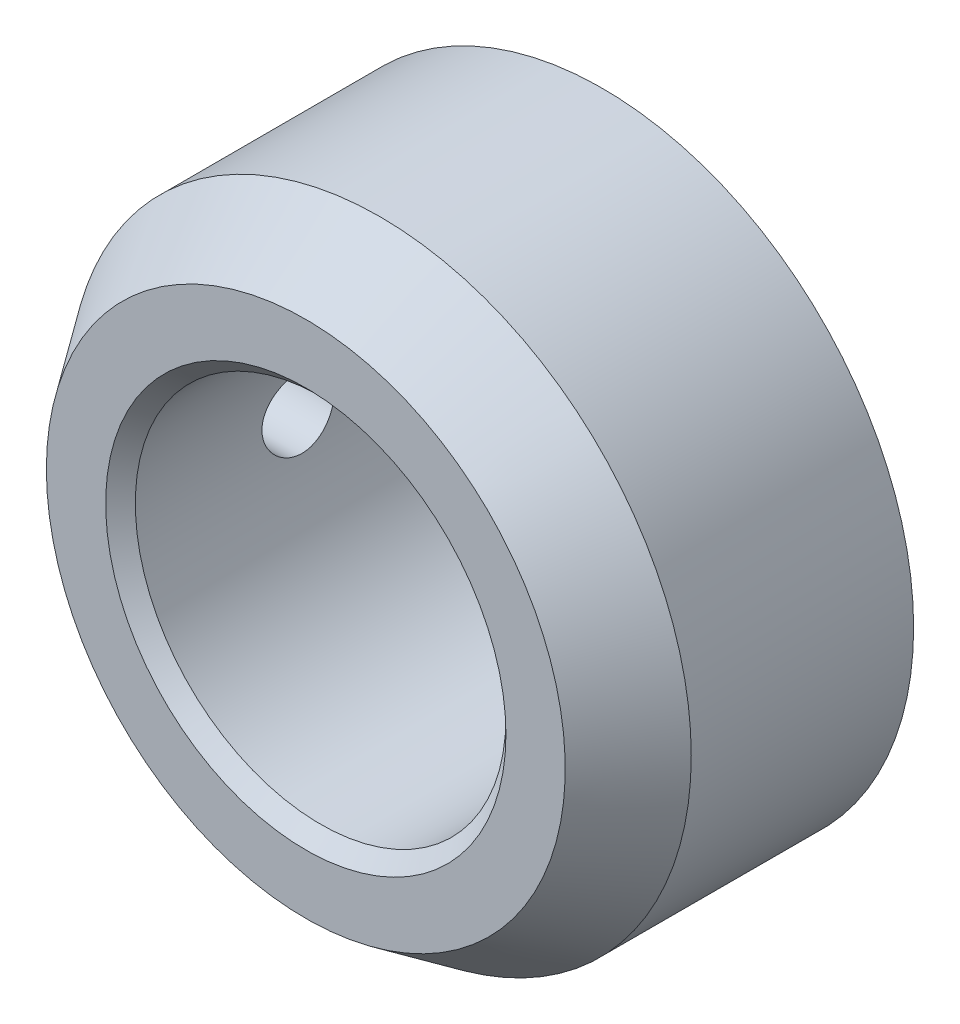
ISO-10303-21;
HEADER;
FILE_DESCRIPTION(('STEP AP214'),'2;1');
FILE_NAME('part.step','',(''),(''),'','','');
FILE_SCHEMA(('AUTOMOTIVE_DESIGN { 1 0 10303 214 1 1 1 1 }'));
ENDSEC;
DATA;
#1=APPLICATION_CONTEXT('core data for automotive mechanical design processes');
#2=APPLICATION_PROTOCOL_DEFINITION('international standard','automotive_design',2000,#1);
#3=PRODUCT_CONTEXT('',#1,'mechanical');
#4=PRODUCT('Part','Part','',(#3));
#5=PRODUCT_RELATED_PRODUCT_CATEGORY('part','',(#4));
#6=PRODUCT_DEFINITION_FORMATION('','',#4);
#7=PRODUCT_DEFINITION_CONTEXT('part definition',#1,'design');
#8=PRODUCT_DEFINITION('design','',#6,#7);
#9=PRODUCT_DEFINITION_SHAPE('','',#8);
#10=(LENGTH_UNIT() NAMED_UNIT(*) SI_UNIT(.MILLI.,.METRE.));
#11=(NAMED_UNIT(*) PLANE_ANGLE_UNIT() SI_UNIT($,.RADIAN.));
#12=(NAMED_UNIT(*) SI_UNIT($,.STERADIAN.) SOLID_ANGLE_UNIT());
#13=UNCERTAINTY_MEASURE_WITH_UNIT(LENGTH_MEASURE(1.E-05),#10,'distance_accuracy_value','');
#14=(GEOMETRIC_REPRESENTATION_CONTEXT(3) GLOBAL_UNCERTAINTY_ASSIGNED_CONTEXT((#13)) GLOBAL_UNIT_ASSIGNED_CONTEXT((#10,
#11,#12)) REPRESENTATION_CONTEXT('',''));
#15=CARTESIAN_POINT('',(0.,0.,0.));
#16=DIRECTION('',(0.,0.,1.));
#17=DIRECTION('',(1.,0.,0.));
#18=AXIS2_PLACEMENT_3D('',#15,#16,#17);
#19=CARTESIAN_POINT('',(0.,0.,9.99999999999872));
#20=DIRECTION('',(0.,0.,1.));
#21=DIRECTION('',(1.,0.,0.));
#22=AXIS2_PLACEMENT_3D('',#19,#20,#21);
#23=CONICAL_SURFACE('',#22,13.5000000000013,0.785398163400004);
#24=CARTESIAN_POINT('',(0.,0.,9.99999999999872));
#25=DIRECTION('',(0.,0.,1.));
#26=DIRECTION('',(1.,0.,0.));
#27=AXIS2_PLACEMENT_3D('',#24,#25,#26);
#28=CIRCLE('',#27,13.5000000000013);
#29=CARTESIAN_POINT('',(13.5000000000013,0.,9.99999999999872));
#30=VERTEX_POINT('',#29);
#31=EDGE_CURVE('E18',#30,#30,#28,.F.);
#32=ORIENTED_EDGE('',*,*,#31,.F.);
#33=EDGE_LOOP('',(#32));
#34=FACE_BOUND('',#33,.T.);
#35=CARTESIAN_POINT('',(0.,0.,9.));
#36=DIRECTION('',(0.,0.,1.));
#37=DIRECTION('',(1.,0.,0.));
#38=AXIS2_PLACEMENT_3D('',#35,#36,#37);
#39=CIRCLE('',#38,12.5);
#40=CARTESIAN_POINT('',(12.5,0.,9.));
#41=VERTEX_POINT('',#40);
#42=EDGE_CURVE('E32',#41,#41,#39,.F.);
#43=ORIENTED_EDGE('',*,*,#42,.T.);
#44=EDGE_LOOP('',(#43));
#45=FACE_BOUND('',#44,.T.);
#46=ADVANCED_FACE('F15',(#34,#45),#23,.F.);
#47=CARTESIAN_POINT('',(0.,0.,0.));
#48=DIRECTION('',(0.,0.,1.));
#49=DIRECTION('',(1.,0.,0.));
#50=AXIS2_PLACEMENT_3D('',#47,#48,#49);
#51=CYLINDRICAL_SURFACE('',#50,12.5);
#52=ORIENTED_EDGE('',*,*,#42,.F.);
#53=EDGE_LOOP('',(#52));
#54=FACE_BOUND('',#53,.T.);
#55=CARTESIAN_POINT('',(-12.2558466761787,2.4585,-2.));
#56=CARTESIAN_POINT('',(-12.2558493768432,2.45849489447485,-2.13665434986014));
#57=CARTESIAN_POINT('',(-12.2581570895164,2.44706753023553,-2.27337352199766));
#58=CARTESIAN_POINT('',(-12.2671256013303,2.40169611642678,-2.54294757798447));
#59=CARTESIAN_POINT('',(-12.2737899404148,2.36773375587934,-2.67579922753586));
#60=CARTESIAN_POINT('',(-12.290688392371,2.27838336125682,-2.9336990663839));
#61=CARTESIAN_POINT('',(-12.3009190149888,2.22301626982965,-3.05875474489886));
#62=CARTESIAN_POINT('',(-12.3237931555826,2.09248492024391,-3.29779749892792));
#63=CARTESIAN_POINT('',(-12.3364365243813,2.01732188593636,-3.41178525810154));
#64=CARTESIAN_POINT('',(-12.3629047890387,1.84823619523452,-3.62702248046835));
#65=CARTESIAN_POINT('',(-12.3767422773664,1.7540947009319,-3.72809850805071));
#66=CARTESIAN_POINT('',(-12.4039287088167,1.55019727777768,-3.9131297901555));
#67=CARTESIAN_POINT('',(-12.4172776182418,1.4404402744591,-3.99708386558795));
#68=CARTESIAN_POINT('',(-12.4421183978385,1.20728144773401,-4.14615882207286));
#69=CARTESIAN_POINT('',(-12.4535936917311,1.08377255247955,-4.21111523764901));
#70=CARTESIAN_POINT('',(-12.4732529658281,0.827330720161315,-4.31929018373911));
#71=CARTESIAN_POINT('',(-12.4814372438866,0.694398637226817,-4.36251068155603));
#72=CARTESIAN_POINT('',(-12.4935033826497,0.42468308176456,-4.42544799290318));
#73=CARTESIAN_POINT('',(-12.4974387852803,0.287970353522989,-4.44545754300337));
#74=CARTESIAN_POINT('',(-12.5007485767955,0.0130755103835713,-4.46231796006168));
#75=CARTESIAN_POINT('',(-12.5001233913098,-0.125106466190689,-4.45917098816634));
#76=CARTESIAN_POINT('',(-12.4944240323339,-0.39700686197698,-4.43003039542503));
#77=CARTESIAN_POINT('',(-12.4894112586764,-0.530760546044906,-4.40435206578883));
#78=CARTESIAN_POINT('',(-12.4755691010109,-0.792022748182368,-4.33137737714901));
#79=CARTESIAN_POINT('',(-12.466739567894,-0.919531022046411,-4.2840801735589));
#80=CARTESIAN_POINT('',(-12.4461543999348,-1.16558645975807,-4.16891598591062));
#81=CARTESIAN_POINT('',(-12.4343811754445,-1.28407395878,-4.10092479682841));
#82=CARTESIAN_POINT('',(-12.4092076186376,-1.50807500566865,-3.94639445933458));
#83=CARTESIAN_POINT('',(-12.395807105048,-1.61358710549122,-3.85985324370562));
#84=CARTESIAN_POINT('',(-12.3685936555743,-1.81051253532592,-3.66894766227692));
#85=CARTESIAN_POINT('',(-12.3547775755051,-1.90165815379644,-3.56430738697832));
#86=CARTESIAN_POINT('',(-12.3285049201257,-2.06514978865956,-3.34108823972524));
#87=CARTESIAN_POINT('',(-12.3160483688696,-2.13749547245634,-3.22250912122801));
#88=CARTESIAN_POINT('',(-12.2938993946044,-2.26142157322873,-2.97440186703642));
#89=CARTESIAN_POINT('',(-12.2842125913729,-2.31295985832155,-2.8448521524546));
#90=CARTESIAN_POINT('',(-12.2687832682912,-2.39346068774231,-2.57869786247068));
#91=CARTESIAN_POINT('',(-12.2630402527814,-2.4224260691201,-2.44209417594092));
#92=CARTESIAN_POINT('',(-12.2562477158845,-2.45656127195772,-2.16813265886687));
#93=CARTESIAN_POINT('',(-12.2551220552395,-2.46211715350928,-2.03082476645752));
#94=CARTESIAN_POINT('',(-12.2574874742678,-2.45031341734828,-1.75724390809483));
#95=CARTESIAN_POINT('',(-12.260978301303,-2.43295505362166,-1.62097088591848));
#96=CARTESIAN_POINT('',(-12.2721121685426,-2.3761480147685,-1.35461796665604));
#97=CARTESIAN_POINT('',(-12.2797166151595,-2.33690455931085,-1.22449254158573));
#98=CARTESIAN_POINT('',(-12.2981872109541,-2.2376602872214,-0.972663742092441));
#99=CARTESIAN_POINT('',(-12.3090536212287,-2.17765780891928,-0.85096104280851));
#100=CARTESIAN_POINT('',(-12.3329954606728,-2.03772086512143,-0.617739970882717));
#101=CARTESIAN_POINT('',(-12.3460970590192,-1.95754420486352,-0.506369658047038));
#102=CARTESIAN_POINT('',(-12.3729607651924,-1.77985867507059,-0.298523346287306));
#103=CARTESIAN_POINT('',(-12.386722938557,-1.68234808317325,-0.202048829245184));
#104=CARTESIAN_POINT('',(-12.4136035942798,-1.47103195439479,-0.0252747543895465));
#105=CARTESIAN_POINT('',(-12.4267095281915,-1.35700651725517,0.0547641491194325));
#106=CARTESIAN_POINT('',(-12.4505847482092,-1.11690324110791,0.194548678586865));
#107=CARTESIAN_POINT('',(-12.4613541303181,-0.990825897589047,0.254295138366999));
#108=CARTESIAN_POINT('',(-12.4792891438607,-0.730892366213479,0.351416083130796));
#109=CARTESIAN_POINT('',(-12.4864747222632,-0.597083967420649,0.388914623623014));
#110=CARTESIAN_POINT('',(-12.4965179383301,-0.324912630092368,0.440869147450933));
#111=CARTESIAN_POINT('',(-12.4993760792922,-0.186550223118433,0.455327810423655));
#112=CARTESIAN_POINT('',(-12.5004309987325,0.0883091507710494,0.460691213295822));
#113=CARTESIAN_POINT('',(-12.4987054279024,0.224798316216774,0.451988318455363));
#114=CARTESIAN_POINT('',(-12.4909495547465,0.494328827489293,0.412140087662162));
#115=CARTESIAN_POINT('',(-12.4849193029335,0.627370213754637,0.380995015054314));
#116=CARTESIAN_POINT('',(-12.469233221628,0.885994180933354,0.297318493029838));
#117=CARTESIAN_POINT('',(-12.4595851413956,1.01159204441389,0.244832734485939));
#118=CARTESIAN_POINT('',(-12.4377037576863,1.25225545133261,0.120013599189595));
#119=CARTESIAN_POINT('',(-12.4254702582139,1.36732019532737,0.0476787175899332));
#120=CARTESIAN_POINT('',(-12.399523065184,1.58559530163353,-0.116116235382723));
#121=CARTESIAN_POINT('',(-12.3857892112487,1.68859207923225,-0.20785777046268));
#122=CARTESIAN_POINT('',(-12.3585109460089,1.87786410848401,-0.407281927867469));
#123=CARTESIAN_POINT('',(-12.34496658024,1.96413540279558,-0.514968312227085));
#124=CARTESIAN_POINT('',(-12.3194467569221,2.11835351412422,-0.744561777018442));
#125=CARTESIAN_POINT('',(-12.3074889918162,2.18610139492036,-0.866604527655249));
#126=CARTESIAN_POINT('',(-12.2867114628495,2.30002209220221,-1.12054050738337));
#127=CARTESIAN_POINT('',(-12.2778888226584,2.34621469689734,-1.25242457238516));
#128=CARTESIAN_POINT('',(-12.2661630086046,2.40663894884108,-1.48719358279993));
#129=CARTESIAN_POINT('',(-12.262318086387,2.42605244683465,-1.58872957867733));
#130=CARTESIAN_POINT('',(-12.2571589407175,2.45198469268812,-1.79349808017582));
#131=CARTESIAN_POINT('',(-12.2558446352909,2.45850385823703,-1.89673053073403));
#132=CARTESIAN_POINT('',(-12.2558466761787,2.4585,-2.));
#133=B_SPLINE_CURVE_WITH_KNOTS('',3,(#55,#56,#57,#58,#59,#60,#61,#62,#63,#64,#65,#66,#67,#68,
#69,#70,#71,#72,#73,#74,#75,#76,#77,#78,#79,#80,#81,#82,#83,#84,#85,#86,#87,#88,#89,#90,#91,#92,
#93,#94,#95,#96,#97,#98,#99,#100,#101,#102,#103,#104,#105,#106,#107,#108,#109,#110,#111,#112,
#113,#114,#115,#116,#117,#118,#119,#120,#121,#122,#123,#124,#125,#126,#127,#128,#129,#130,#131,
#132),.UNSPECIFIED.,.T.,.F.,(4,2,2,2,2,2,2,2,2,2,2,2,2,2,2,2,2,2,2,2,2,2,2,2,2,2,2,2,2,2,2,2,2,
2,2,2,2,2,4),(0.,0.409584987136586,0.819503193814827,1.22902134247092,1.63851417929385,
2.0530308482641,2.46757605297233,2.88561045760278,3.30360701941405,3.71627243400728,
4.1288993359465,4.53584263552102,4.94280183454503,5.35225344496449,5.76175070846819,
6.1781524078926,6.59456147351477,7.01180952688054,7.42900513043566,7.83929290833488,
8.24955823409671,8.65603960660824,9.06255352373294,9.47420226729666,9.88589193665889,
10.3036774930254,10.7214458803995,11.1368623267066,11.552230454764,11.9606070704631,
12.3689788941966,12.7764809506949,13.184013910213,13.597921640957,14.0119271853487,
14.4302184340929,14.8481249232944,15.1576576568476,15.4671803634734),.UNSPECIFIED.);
#134=CARTESIAN_POINT('',(-12.2558466761787,2.4585,-2.));
#135=VERTEX_POINT('',#134);
#136=EDGE_CURVE('E63',#135,#135,#133,.T.);
#137=ORIENTED_EDGE('',*,*,#136,.T.);
#138=EDGE_LOOP('',(#137));
#139=FACE_BOUND('',#138,.T.);
#140=CARTESIAN_POINT('',(0.,0.,-10.));
#141=DIRECTION('',(0.,0.,1.));
#142=DIRECTION('',(1.,0.,0.));
#143=AXIS2_PLACEMENT_3D('',#140,#141,#142);
#144=CIRCLE('',#143,12.5);
#145=CARTESIAN_POINT('',(12.5,0.,-10.));
#146=VERTEX_POINT('',#145);
#147=EDGE_CURVE('E66',#146,#146,#144,.F.);
#148=ORIENTED_EDGE('',*,*,#147,.T.);
#149=EDGE_LOOP('',(#148));
#150=FACE_BOUND('',#149,.T.);
#151=ADVANCED_FACE('F70',(#54,#139,#150),#51,.F.);
#152=CARTESIAN_POINT('',(0.,0.,10.));
#153=DIRECTION('',(0.,0.,1.));
#154=DIRECTION('',(1.,0.,0.));
#155=AXIS2_PLACEMENT_3D('',#152,#153,#154);
#156=PLANE('',#155);
#157=ORIENTED_EDGE('',*,*,#31,.T.);
#158=EDGE_LOOP('',(#157));
#159=FACE_BOUND('',#158,.T.);
#160=CARTESIAN_POINT('',(0.,0.,9.99999999999653));
#161=DIRECTION('',(0.,0.,-1.));
#162=DIRECTION('',(-1.,0.,0.));
#163=AXIS2_PLACEMENT_3D('',#160,#161,#162);
#164=CIRCLE('',#163,17.499999999995);
#165=CARTESIAN_POINT('',(-17.499999999995,0.,9.99999999999653));
#166=VERTEX_POINT('',#165);
#167=EDGE_CURVE('E61',#166,#166,#164,.T.);
#168=ORIENTED_EDGE('',*,*,#167,.F.);
#169=EDGE_LOOP('',(#168));
#170=FACE_BOUND('',#169,.T.);
#171=ADVANCED_FACE('F74',(#159,#170),#156,.T.);
#172=CARTESIAN_POINT('',(0.,0.,-10.));
#173=DIRECTION('',(0.,0.,1.));
#174=DIRECTION('',(1.,0.,0.));
#175=AXIS2_PLACEMENT_3D('',#172,#173,#174);
#176=PLANE('',#175);
#177=ORIENTED_EDGE('',*,*,#147,.F.);
#178=EDGE_LOOP('',(#177));
#179=FACE_BOUND('',#178,.T.);
#180=CARTESIAN_POINT('',(0.,0.,-10.));
#181=DIRECTION('',(0.,0.,1.));
#182=DIRECTION('',(1.,0.,0.));
#183=AXIS2_PLACEMENT_3D('',#180,#181,#182);
#184=CIRCLE('',#183,21.);
#185=CARTESIAN_POINT('',(21.,0.,-10.));
#186=VERTEX_POINT('',#185);
#187=EDGE_CURVE('E27',#186,#186,#184,.T.);
#188=ORIENTED_EDGE('',*,*,#187,.F.);
#189=EDGE_LOOP('',(#188));
#190=FACE_BOUND('',#189,.T.);
#191=ADVANCED_FACE('F56',(#179,#190),#176,.F.);
#192=CARTESIAN_POINT('',(-11.25,0.,-2.));
#193=DIRECTION('',(1.,0.,0.));
#194=DIRECTION('',(0.,0.,-1.));
#195=AXIS2_PLACEMENT_3D('',#192,#193,#194);
#196=CYLINDRICAL_SURFACE('',#195,2.4585);
#197=ORIENTED_EDGE('',*,*,#136,.F.);
#198=EDGE_LOOP('',(#197));
#199=FACE_BOUND('',#198,.T.);
#200=CARTESIAN_POINT('',(-20.8555934403699,2.4585,-2.));
#201=CARTESIAN_POINT('',(-20.8555953048463,2.45849411025697,-1.86241361649331));
#202=CARTESIAN_POINT('',(-20.8569696371966,2.44691131891609,-1.72473953930744));
#203=CARTESIAN_POINT('',(-20.8623168474132,2.40088562096684,-1.45321794821167));
#204=CARTESIAN_POINT('',(-20.8662924911736,2.36641838145623,-1.3193746657481));
#205=CARTESIAN_POINT('',(-20.8763859747241,2.27564953153921,-1.05948545498699));
#206=CARTESIAN_POINT('',(-20.8825024133264,2.21936220018089,-0.933434489822287));
#207=CARTESIAN_POINT('',(-20.8961866202913,2.08658051220708,-0.692592815136642));
#208=CARTESIAN_POINT('',(-20.9037541268414,2.01008979990039,-0.577800079959245));
#209=CARTESIAN_POINT('',(-20.919529565174,1.83866859345344,-0.362143027744996));
#210=CARTESIAN_POINT('',(-20.9277401658486,1.74365852166854,-0.261342153786151));
#211=CARTESIAN_POINT('',(-20.9438525962691,1.53806656984076,-0.0770776649456995));
#212=CARTESIAN_POINT('',(-20.9517544110683,1.42748393720134,0.0063851115310453));
#213=CARTESIAN_POINT('',(-20.9663859970604,1.19349006432672,0.153829358329019));
#214=CARTESIAN_POINT('',(-20.9731123120773,1.07004264325174,0.21775378184214));
#215=CARTESIAN_POINT('',(-20.9846057764123,0.814073279922334,0.323941517068433));
#216=CARTESIAN_POINT('',(-20.9893729899022,0.681551635066983,0.366205538295903));
#217=CARTESIAN_POINT('',(-20.9963923359192,0.411842381370482,0.427684211368029));
#218=CARTESIAN_POINT('',(-20.9986559371576,0.27467904062935,0.447003997959946));
#219=CARTESIAN_POINT('',(-21.0004521265055,-0.000960467713847406,0.462371435119844));
#220=CARTESIAN_POINT('',(-20.999984809587,-0.139436589494617,0.458419894985919));
#221=CARTESIAN_POINT('',(-20.9963811311973,-0.41305607513613,0.427441472225288));
#222=CARTESIAN_POINT('',(-20.9932578474922,-0.548212435997025,0.400527651878404));
#223=CARTESIAN_POINT('',(-20.9847079601084,-0.812076745963884,0.324565187577207));
#224=CARTESIAN_POINT('',(-20.9792813172501,-0.940784585340534,0.275516167107988));
#225=CARTESIAN_POINT('',(-20.9667120326188,-1.1884505031565,0.156554121949644));
#226=CARTESIAN_POINT('',(-20.9595653436368,-1.30738468569218,0.0865917935859649));
#227=CARTESIAN_POINT('',(-20.9443563436158,-1.53186648985309,-0.0721750535980664));
#228=CARTESIAN_POINT('',(-20.9362939957387,-1.63741357253762,-0.160980330617384));
#229=CARTESIAN_POINT('',(-20.9200997473893,-1.8327886438205,-0.355546367367609));
#230=CARTESIAN_POINT('',(-20.9119677197421,-1.92251858297297,-0.461405602369954));
#231=CARTESIAN_POINT('',(-20.8965985268971,-2.08295122930062,-0.686735252621997));
#232=CARTESIAN_POINT('',(-20.8893613639198,-2.1536538892601,-0.806205701646513));
#233=CARTESIAN_POINT('',(-20.8766011961308,-2.27402851192203,-1.05544971532109));
#234=CARTESIAN_POINT('',(-20.8710787816207,-2.32369323445948,-1.18522680876627));
#235=CARTESIAN_POINT('',(-20.8623851660336,-2.40049843839129,-1.45135761323723));
#236=CARTESIAN_POINT('',(-20.8592138659857,-2.42763986791588,-1.58771104717269));
#237=CARTESIAN_POINT('',(-20.8555993589822,-2.45849946320357,-1.86225976884871));
#238=CARTESIAN_POINT('',(-20.8551401136826,-2.46235533639836,-2.00043937517702));
#239=CARTESIAN_POINT('',(-20.8569593328356,-2.44689713235431,-2.27547582568603));
#240=CARTESIAN_POINT('',(-20.8592377462634,-2.42758348695035,-2.41233269447206));
#241=CARTESIAN_POINT('',(-20.8662609469053,-2.36645018856872,-2.68042998481279));
#242=CARTESIAN_POINT('',(-20.8709984840051,-2.32469668120681,-2.8116856955746));
#243=CARTESIAN_POINT('',(-20.8824002602098,-2.21993678362521,-3.06533206417679));
#244=CARTESIAN_POINT('',(-20.8890645590805,-2.15692973413747,-3.18772244687863));
#245=CARTESIAN_POINT('',(-20.9036075285408,-2.01111053728903,-3.42078856558038));
#246=CARTESIAN_POINT('',(-20.9114916957134,-1.92820776110659,-3.53140725063868));
#247=CARTESIAN_POINT('',(-20.9275685636402,-1.74507913555395,-3.73720902768221));
#248=CARTESIAN_POINT('',(-20.9357612748898,-1.6448526964865,-3.83239159400832));
#249=CARTESIAN_POINT('',(-20.9515811109777,-1.42932165008672,-4.0050999753548));
#250=CARTESIAN_POINT('',(-20.9592052168722,-1.31394445782414,-4.08253552388648));
#251=CARTESIAN_POINT('',(-20.9729840965463,-1.07174189847841,-4.2169283507601));
#252=CARTESIAN_POINT('',(-20.9791388967874,-0.944916737624237,-4.27388599790833));
#253=CARTESIAN_POINT('',(-20.9892722163445,-0.683723433233825,-4.36555581194995));
#254=CARTESIAN_POINT('',(-20.9932559139679,-0.549374087999753,-4.40032094457883));
#255=CARTESIAN_POINT('',(-20.9986195965855,-0.276695587012278,-4.44679138052324));
#256=CARTESIAN_POINT('',(-20.9999996838594,-0.138366587811658,-4.45849758968233));
#257=CARTESIAN_POINT('',(-21.0000003141781,0.137461436276966,-4.45850239528841));
#258=CARTESIAN_POINT('',(-20.9986373032959,0.274960479708635,-4.44694049424028));
#259=CARTESIAN_POINT('',(-20.9933374752217,0.546047559925447,-4.40103174153609));
#260=CARTESIAN_POINT('',(-20.9894006583654,0.679635597220584,-4.36668489285119));
#261=CARTESIAN_POINT('',(-20.9793937939639,0.939096070277816,-4.27622333253779));
#262=CARTESIAN_POINT('',(-20.9733243165278,1.06497055749842,-4.22011443798858));
#263=CARTESIAN_POINT('',(-20.9597257317287,1.30553859855283,-4.08773599361807));
#264=CARTESIAN_POINT('',(-20.9521966157177,1.42023208613643,-4.0114663243491));
#265=CARTESIAN_POINT('',(-20.9364663007633,1.6358961325634,-3.84041243006898));
#266=CARTESIAN_POINT('',(-20.928261487065,1.73678401281979,-3.74552429183937));
#267=CARTESIAN_POINT('',(-20.9121341104077,1.92126140240649,-3.54014044152321));
#268=CARTESIAN_POINT('',(-20.9042116150317,2.00484679250707,-3.4296410233465));
#269=CARTESIAN_POINT('',(-20.8895171704809,2.15258443227715,-3.19574559134515));
#270=CARTESIAN_POINT('',(-20.8827492241657,2.2166696526806,-3.0723070123334));
#271=CARTESIAN_POINT('',(-20.8711772493062,2.32311273704533,-2.8164134334299));
#272=CARTESIAN_POINT('',(-20.8663710588666,2.36549453181886,-2.68396854754813));
#273=CARTESIAN_POINT('',(-20.8604492328802,2.4170362222418,-2.4590127758894));
#274=CARTESIAN_POINT('',(-20.8586372214815,2.43256316265866,-2.36792785478393));
#275=CARTESIAN_POINT('',(-20.8562087035714,2.45329699456815,-2.18457510812712));
#276=CARTESIAN_POINT('',(-20.8555921894847,2.45850395145366,-2.09230729007497));
#277=CARTESIAN_POINT('',(-20.8555934403699,2.4585,-2.));
#278=B_SPLINE_CURVE_WITH_KNOTS('',3,(#200,#201,#202,#203,#204,#205,#206,#207,#208,#209,#210,
#211,#212,#213,#214,#215,#216,#217,#218,#219,#220,#221,#222,#223,#224,#225,#226,#227,#228,#229,
#230,#231,#232,#233,#234,#235,#236,#237,#238,#239,#240,#241,#242,#243,#244,#245,#246,#247,#248,
#249,#250,#251,#252,#253,#254,#255,#256,#257,#258,#259,#260,#261,#262,#263,#264,#265,#266,#267,
#268,#269,#270,#271,#272,#273,#274,#275,#276,#277),.UNSPECIFIED.,.T.,.F.,(4,2,2,2,2,2,2,2,2,2,2,
2,2,2,2,2,2,2,2,2,2,2,2,2,2,2,2,2,2,2,2,2,2,2,2,2,2,2,4),(0.,0.412421980617917,0.82528319095163,
1.23787468013356,1.65039179635992,2.06472221088907,2.47907265620959,2.89462158599396,
3.31015690306927,3.72378072184028,4.13739015625774,4.54897472563523,4.96056629623999,
5.37313596204713,5.78572223190281,6.20078244499998,6.61584368804855,7.03104765778891,
7.44623414840647,7.8589628622478,8.27168388374628,8.6831949537395,9.09471878965402,
9.50815401640611,9.92160331926013,10.337111050769,10.7526112986235,11.1671161487981,
11.5816047152968,11.9936156448822,12.4056265207412,12.8175273403117,13.2294306003487,
13.6437017480517,14.0580714087659,14.4738497262314,14.8891686022412,15.1658660170513,
15.4425616785543),.UNSPECIFIED.);
#279=CARTESIAN_POINT('',(-20.8555934403699,2.4585,-2.));
#280=VERTEX_POINT('',#279);
#281=EDGE_CURVE('E22',#280,#280,#278,.T.);
#282=ORIENTED_EDGE('',*,*,#281,.F.);
#283=EDGE_LOOP('',(#282));
#284=FACE_BOUND('',#283,.T.);
#285=ADVANCED_FACE('F42',(#199,#284),#196,.F.);
#286=CARTESIAN_POINT('',(0.,0.,5.00000000000347));
#287=DIRECTION('',(0.,0.,-1.));
#288=DIRECTION('',(-1.,0.,0.));
#289=AXIS2_PLACEMENT_3D('',#286,#287,#288);
#290=CONICAL_SURFACE('',#289,21.000000000005,0.610725964391193);
#291=ORIENTED_EDGE('',*,*,#167,.T.);
#292=EDGE_LOOP('',(#291));
#293=FACE_BOUND('',#292,.T.);
#294=CARTESIAN_POINT('',(0.,0.,5.));
#295=DIRECTION('',(0.,0.,1.));
#296=DIRECTION('',(1.,0.,0.));
#297=AXIS2_PLACEMENT_3D('',#294,#295,#296);
#298=CIRCLE('',#297,21.);
#299=CARTESIAN_POINT('',(21.,0.,5.));
#300=VERTEX_POINT('',#299);
#301=EDGE_CURVE('E10',#300,#300,#298,.F.);
#302=ORIENTED_EDGE('',*,*,#301,.F.);
#303=EDGE_LOOP('',(#302));
#304=FACE_BOUND('',#303,.T.);
#305=ADVANCED_FACE('F49',(#293,#304),#290,.T.);
#306=CARTESIAN_POINT('',(0.,0.,0.));
#307=DIRECTION('',(0.,0.,1.));
#308=DIRECTION('',(1.,0.,0.));
#309=AXIS2_PLACEMENT_3D('',#306,#307,#308);
#310=CYLINDRICAL_SURFACE('',#309,21.);
#311=ORIENTED_EDGE('',*,*,#301,.T.);
#312=EDGE_LOOP('',(#311));
#313=FACE_BOUND('',#312,.T.);
#314=ORIENTED_EDGE('',*,*,#281,.T.);
#315=EDGE_LOOP('',(#314));
#316=FACE_BOUND('',#315,.T.);
#317=ORIENTED_EDGE('',*,*,#187,.T.);
#318=EDGE_LOOP('',(#317));
#319=FACE_BOUND('',#318,.T.);
#320=ADVANCED_FACE('F46',(#313,#316,#319),#310,.T.);
#321=CLOSED_SHELL('',(#46,#151,#171,#191,#285,#305,#320));
#322=MANIFOLD_SOLID_BREP('B1',#321);
#323=ADVANCED_BREP_SHAPE_REPRESENTATION('',(#18,#322),#14);
#324=SHAPE_DEFINITION_REPRESENTATION(#9,#323);
ENDSEC;
END-ISO-10303-21;
